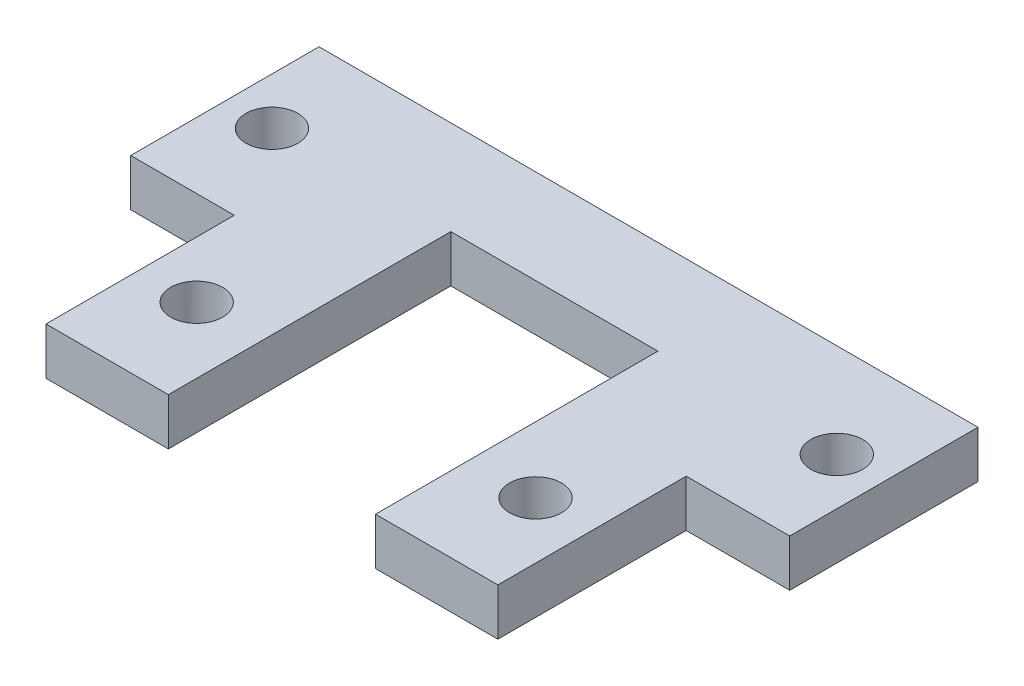
ISO-10303-21;
HEADER;
FILE_DESCRIPTION(('STEP AP214'),'2;1');
FILE_NAME('part.step','',(''),(''),'','','');
FILE_SCHEMA(('AUTOMOTIVE_DESIGN { 1 0 10303 214 1 1 1 1 }'));
ENDSEC;
DATA;
#1=APPLICATION_CONTEXT('core data for automotive mechanical design processes');
#2=APPLICATION_PROTOCOL_DEFINITION('international standard','automotive_design',2000,#1);
#3=PRODUCT_CONTEXT('',#1,'mechanical');
#4=PRODUCT('Part','Part','',(#3));
#5=PRODUCT_RELATED_PRODUCT_CATEGORY('part','',(#4));
#6=PRODUCT_DEFINITION_FORMATION('','',#4);
#7=PRODUCT_DEFINITION_CONTEXT('part definition',#1,'design');
#8=PRODUCT_DEFINITION('design','',#6,#7);
#9=PRODUCT_DEFINITION_SHAPE('','',#8);
#10=(LENGTH_UNIT() NAMED_UNIT(*) SI_UNIT(.MILLI.,.METRE.));
#11=(NAMED_UNIT(*) PLANE_ANGLE_UNIT() SI_UNIT($,.RADIAN.));
#12=(NAMED_UNIT(*) SI_UNIT($,.STERADIAN.) SOLID_ANGLE_UNIT());
#13=UNCERTAINTY_MEASURE_WITH_UNIT(LENGTH_MEASURE(1.E-05),#10,'distance_accuracy_value','');
#14=(GEOMETRIC_REPRESENTATION_CONTEXT(3) GLOBAL_UNCERTAINTY_ASSIGNED_CONTEXT((#13)) GLOBAL_UNIT_ASSIGNED_CONTEXT((#10,
#11,#12)) REPRESENTATION_CONTEXT('',''));
#15=CARTESIAN_POINT('',(0.,0.,0.));
#16=DIRECTION('',(0.,0.,1.));
#17=DIRECTION('',(1.,0.,0.));
#18=AXIS2_PLACEMENT_3D('',#15,#16,#17);
#19=CARTESIAN_POINT('',(0.,3.175,19.05));
#20=DIRECTION('',(0.,0.,1.));
#21=DIRECTION('',(1.,0.,0.));
#22=AXIS2_PLACEMENT_3D('',#19,#20,#21);
#23=PLANE('',#22);
#24=DIRECTION('',(0.,1.,0.));
#25=VECTOR('',#24,1.);
#26=CARTESIAN_POINT('',(6.985,-22.225,19.05));
#27=LINE('',#26,#25);
#28=CARTESIAN_POINT('',(6.985,0.,19.05));
#29=VERTEX_POINT('',#28);
#30=CARTESIAN_POINT('',(6.985,3.175,19.05));
#31=VERTEX_POINT('',#30);
#32=EDGE_CURVE('E311',#29,#31,#27,.T.);
#33=ORIENTED_EDGE('',*,*,#32,.F.);
#34=DIRECTION('',(-1.,0.,0.));
#35=VECTOR('',#34,1.);
#36=CARTESIAN_POINT('',(0.,0.,19.05));
#37=LINE('',#36,#35);
#38=CARTESIAN_POINT('',(15.24,0.,19.05));
#39=VERTEX_POINT('',#38);
#40=EDGE_CURVE('E184',#39,#29,#37,.T.);
#41=ORIENTED_EDGE('',*,*,#40,.F.);
#42=DIRECTION('',(0.,-1.,0.));
#43=VECTOR('',#42,1.);
#44=CARTESIAN_POINT('',(15.24,3.175,19.05));
#45=LINE('',#44,#43);
#46=CARTESIAN_POINT('',(15.24,3.175,19.05));
#47=VERTEX_POINT('',#46);
#48=EDGE_CURVE('E69',#47,#39,#45,.T.);
#49=ORIENTED_EDGE('',*,*,#48,.F.);
#50=DIRECTION('',(-1.,0.,0.));
#51=VECTOR('',#50,1.);
#52=CARTESIAN_POINT('',(0.,3.175,19.05));
#53=LINE('',#52,#51);
#54=EDGE_CURVE('E156',#47,#31,#53,.T.);
#55=ORIENTED_EDGE('',*,*,#54,.T.);
#56=EDGE_LOOP('',(#33,#41,#49,#55));
#57=FACE_BOUND('',#56,.T.);
#58=ADVANCED_FACE('F45',(#57),#23,.T.);
#59=CARTESIAN_POINT('',(15.24,3.175,0.));
#60=DIRECTION('',(1.,0.,0.));
#61=DIRECTION('',(0.,0.,-1.));
#62=AXIS2_PLACEMENT_3D('',#59,#60,#61);
#63=PLANE('',#62);
#64=DIRECTION('',(0.,0.,1.));
#65=VECTOR('',#64,1.);
#66=CARTESIAN_POINT('',(15.24,0.,0.));
#67=LINE('',#66,#65);
#68=CARTESIAN_POINT('',(15.24,0.,6.35));
#69=VERTEX_POINT('',#68);
#70=EDGE_CURVE('E167',#69,#39,#67,.T.);
#71=ORIENTED_EDGE('',*,*,#70,.F.);
#72=DIRECTION('',(0.,-1.,0.));
#73=VECTOR('',#72,1.);
#74=CARTESIAN_POINT('',(15.24,3.175,6.35));
#75=LINE('',#74,#73);
#76=CARTESIAN_POINT('',(15.24,3.175,6.35));
#77=VERTEX_POINT('',#76);
#78=EDGE_CURVE('E105',#77,#69,#75,.T.);
#79=ORIENTED_EDGE('',*,*,#78,.F.);
#80=DIRECTION('',(0.,0.,1.));
#81=VECTOR('',#80,1.);
#82=CARTESIAN_POINT('',(15.24,3.175,0.));
#83=LINE('',#82,#81);
#84=EDGE_CURVE('E193',#77,#47,#83,.T.);
#85=ORIENTED_EDGE('',*,*,#84,.T.);
#86=ORIENTED_EDGE('',*,*,#48,.T.);
#87=EDGE_LOOP('',(#71,#79,#85,#86));
#88=FACE_BOUND('',#87,.T.);
#89=ADVANCED_FACE('F47',(#88),#63,.T.);
#90=CARTESIAN_POINT('',(0.,3.175,6.35));
#91=DIRECTION('',(0.,0.,-1.));
#92=DIRECTION('',(-1.,0.,0.));
#93=AXIS2_PLACEMENT_3D('',#90,#91,#92);
#94=PLANE('',#93);
#95=DIRECTION('',(1.,0.,0.));
#96=VECTOR('',#95,1.);
#97=CARTESIAN_POINT('',(0.,0.,6.35));
#98=LINE('',#97,#96);
#99=CARTESIAN_POINT('',(22.225,0.,6.35));
#100=VERTEX_POINT('',#99);
#101=EDGE_CURVE('E169',#69,#100,#98,.T.);
#102=ORIENTED_EDGE('',*,*,#101,.T.);
#103=DIRECTION('',(0.,-1.,0.));
#104=VECTOR('',#103,1.);
#105=CARTESIAN_POINT('',(22.225,3.175,6.35));
#106=LINE('',#105,#104);
#107=CARTESIAN_POINT('',(22.225,3.175,6.35));
#108=VERTEX_POINT('',#107);
#109=EDGE_CURVE('E201',#108,#100,#106,.T.);
#110=ORIENTED_EDGE('',*,*,#109,.F.);
#111=DIRECTION('',(1.,0.,0.));
#112=VECTOR('',#111,1.);
#113=CARTESIAN_POINT('',(0.,3.175,6.35));
#114=LINE('',#113,#112);
#115=EDGE_CURVE('E140',#77,#108,#114,.T.);
#116=ORIENTED_EDGE('',*,*,#115,.F.);
#117=ORIENTED_EDGE('',*,*,#78,.T.);
#118=EDGE_LOOP('',(#102,#110,#116,#117));
#119=FACE_BOUND('',#118,.T.);
#120=ADVANCED_FACE('F242',(#119),#94,.F.);
#121=CARTESIAN_POINT('',(22.225,3.175,0.));
#122=DIRECTION('',(1.,0.,0.));
#123=DIRECTION('',(0.,0.,-1.));
#124=AXIS2_PLACEMENT_3D('',#121,#122,#123);
#125=PLANE('',#124);
#126=DIRECTION('',(0.,0.,1.));
#127=VECTOR('',#126,1.);
#128=CARTESIAN_POINT('',(22.225,0.,0.));
#129=LINE('',#128,#127);
#130=CARTESIAN_POINT('',(22.225,0.,-6.35));
#131=VERTEX_POINT('',#130);
#132=EDGE_CURVE('E173',#131,#100,#129,.T.);
#133=ORIENTED_EDGE('',*,*,#132,.F.);
#134=DIRECTION('',(0.,-1.,0.));
#135=VECTOR('',#134,1.);
#136=CARTESIAN_POINT('',(22.225,3.175,-6.35));
#137=LINE('',#136,#135);
#138=CARTESIAN_POINT('',(22.225,3.175,-6.35));
#139=VERTEX_POINT('',#138);
#140=EDGE_CURVE('E199',#139,#131,#137,.T.);
#141=ORIENTED_EDGE('',*,*,#140,.F.);
#142=DIRECTION('',(0.,0.,1.));
#143=VECTOR('',#142,1.);
#144=CARTESIAN_POINT('',(22.225,3.175,0.));
#145=LINE('',#144,#143);
#146=EDGE_CURVE('E321',#139,#108,#145,.T.);
#147=ORIENTED_EDGE('',*,*,#146,.T.);
#148=ORIENTED_EDGE('',*,*,#109,.T.);
#149=EDGE_LOOP('',(#133,#141,#147,#148));
#150=FACE_BOUND('',#149,.T.);
#151=ADVANCED_FACE('F237',(#150),#125,.T.);
#152=CARTESIAN_POINT('',(0.,3.175,-6.35));
#153=DIRECTION('',(0.,0.,-1.));
#154=DIRECTION('',(-1.,0.,0.));
#155=AXIS2_PLACEMENT_3D('',#152,#153,#154);
#156=PLANE('',#155);
#157=DIRECTION('',(1.,0.,0.));
#158=VECTOR('',#157,1.);
#159=CARTESIAN_POINT('',(0.,0.,-6.35));
#160=LINE('',#159,#158);
#161=CARTESIAN_POINT('',(-22.225,0.,-6.35));
#162=VERTEX_POINT('',#161);
#163=EDGE_CURVE('E176',#162,#131,#160,.T.);
#164=ORIENTED_EDGE('',*,*,#163,.F.);
#165=DIRECTION('',(0.,-1.,0.));
#166=VECTOR('',#165,1.);
#167=CARTESIAN_POINT('',(-22.225,3.175,-6.35));
#168=LINE('',#167,#166);
#169=CARTESIAN_POINT('',(-22.225,3.175,-6.35));
#170=VERTEX_POINT('',#169);
#171=EDGE_CURVE('E197',#170,#162,#168,.T.);
#172=ORIENTED_EDGE('',*,*,#171,.F.);
#173=DIRECTION('',(1.,0.,0.));
#174=VECTOR('',#173,1.);
#175=CARTESIAN_POINT('',(0.,3.175,-6.35));
#176=LINE('',#175,#174);
#177=EDGE_CURVE('E233',#170,#139,#176,.T.);
#178=ORIENTED_EDGE('',*,*,#177,.T.);
#179=ORIENTED_EDGE('',*,*,#140,.T.);
#180=EDGE_LOOP('',(#164,#172,#178,#179));
#181=FACE_BOUND('',#180,.T.);
#182=ADVANCED_FACE('F230',(#181),#156,.T.);
#183=CARTESIAN_POINT('',(-22.225,3.175,0.));
#184=DIRECTION('',(1.,0.,0.));
#185=DIRECTION('',(0.,0.,-1.));
#186=AXIS2_PLACEMENT_3D('',#183,#184,#185);
#187=PLANE('',#186);
#188=DIRECTION('',(0.,0.,1.));
#189=VECTOR('',#188,1.);
#190=CARTESIAN_POINT('',(-22.225,0.,0.));
#191=LINE('',#190,#189);
#192=CARTESIAN_POINT('',(-22.225,0.,6.35));
#193=VERTEX_POINT('',#192);
#194=EDGE_CURVE('E179',#162,#193,#191,.T.);
#195=ORIENTED_EDGE('',*,*,#194,.T.);
#196=DIRECTION('',(0.,-1.,0.));
#197=VECTOR('',#196,1.);
#198=CARTESIAN_POINT('',(-22.225,3.175,6.35));
#199=LINE('',#198,#197);
#200=CARTESIAN_POINT('',(-22.225,3.175,6.35));
#201=VERTEX_POINT('',#200);
#202=EDGE_CURVE('E149',#201,#193,#199,.T.);
#203=ORIENTED_EDGE('',*,*,#202,.F.);
#204=DIRECTION('',(0.,0.,1.));
#205=VECTOR('',#204,1.);
#206=CARTESIAN_POINT('',(-22.225,3.175,0.));
#207=LINE('',#206,#205);
#208=EDGE_CURVE('E135',#170,#201,#207,.T.);
#209=ORIENTED_EDGE('',*,*,#208,.F.);
#210=ORIENTED_EDGE('',*,*,#171,.T.);
#211=EDGE_LOOP('',(#195,#203,#209,#210));
#212=FACE_BOUND('',#211,.T.);
#213=ADVANCED_FACE('F415',(#212),#187,.F.);
#214=CARTESIAN_POINT('',(-15.24,0.,6.35));
#215=VERTEX_POINT('',#214);
#216=EDGE_CURVE('E145',#193,#215,#98,.T.);
#217=ORIENTED_EDGE('',*,*,#216,.T.);
#218=DIRECTION('',(0.,-1.,0.));
#219=VECTOR('',#218,1.);
#220=CARTESIAN_POINT('',(-15.24,3.175,6.35));
#221=LINE('',#220,#219);
#222=CARTESIAN_POINT('',(-15.24,3.175,6.35));
#223=VERTEX_POINT('',#222);
#224=EDGE_CURVE('E142',#223,#215,#221,.T.);
#225=ORIENTED_EDGE('',*,*,#224,.F.);
#226=EDGE_CURVE('E124',#201,#223,#114,.T.);
#227=ORIENTED_EDGE('',*,*,#226,.F.);
#228=ORIENTED_EDGE('',*,*,#202,.T.);
#229=EDGE_LOOP('',(#217,#225,#227,#228));
#230=FACE_BOUND('',#229,.T.);
#231=ADVANCED_FACE('F143',(#230),#94,.F.);
#232=CARTESIAN_POINT('',(-15.24,3.175,0.));
#233=DIRECTION('',(1.,0.,0.));
#234=DIRECTION('',(0.,0.,-1.));
#235=AXIS2_PLACEMENT_3D('',#232,#233,#234);
#236=PLANE('',#235);
#237=DIRECTION('',(0.,0.,1.));
#238=VECTOR('',#237,1.);
#239=CARTESIAN_POINT('',(-15.24,0.,0.));
#240=LINE('',#239,#238);
#241=CARTESIAN_POINT('',(-15.24,0.,19.05));
#242=VERTEX_POINT('',#241);
#243=EDGE_CURVE('E181',#215,#242,#240,.T.);
#244=ORIENTED_EDGE('',*,*,#243,.T.);
#245=DIRECTION('',(0.,-1.,0.));
#246=VECTOR('',#245,1.);
#247=CARTESIAN_POINT('',(-15.24,3.175,19.05));
#248=LINE('',#247,#246);
#249=CARTESIAN_POINT('',(-15.24,3.175,19.05));
#250=VERTEX_POINT('',#249);
#251=EDGE_CURVE('E150',#250,#242,#248,.T.);
#252=ORIENTED_EDGE('',*,*,#251,.F.);
#253=DIRECTION('',(0.,0.,1.));
#254=VECTOR('',#253,1.);
#255=CARTESIAN_POINT('',(-15.24,3.175,0.));
#256=LINE('',#255,#254);
#257=EDGE_CURVE('E131',#223,#250,#256,.T.);
#258=ORIENTED_EDGE('',*,*,#257,.F.);
#259=ORIENTED_EDGE('',*,*,#224,.T.);
#260=EDGE_LOOP('',(#244,#252,#258,#259));
#261=FACE_BOUND('',#260,.T.);
#262=ADVANCED_FACE('F152',(#261),#236,.F.);
#263=CARTESIAN_POINT('',(19.05,3.175,0.));
#264=DIRECTION('',(0.,-1.,0.));
#265=DIRECTION('',(0.,0.,-1.));
#266=AXIS2_PLACEMENT_3D('',#263,#264,#265);
#267=CYLINDRICAL_SURFACE('',#266,1.75);
#268=CARTESIAN_POINT('',(19.05,3.175,0.));
#269=DIRECTION('',(0.,1.,0.));
#270=DIRECTION('',(0.,0.,1.));
#271=AXIS2_PLACEMENT_3D('',#268,#269,#270);
#272=CIRCLE('',#271,1.75);
#273=CARTESIAN_POINT('',(19.05,3.175,1.75));
#274=VERTEX_POINT('',#273);
#275=EDGE_CURVE('E161',#274,#274,#272,.T.);
#276=ORIENTED_EDGE('',*,*,#275,.T.);
#277=EDGE_LOOP('',(#276));
#278=FACE_BOUND('',#277,.T.);
#279=CARTESIAN_POINT('',(19.05,0.,0.));
#280=DIRECTION('',(0.,1.,0.));
#281=DIRECTION('',(0.,0.,1.));
#282=AXIS2_PLACEMENT_3D('',#279,#280,#281);
#283=CIRCLE('',#282,1.75);
#284=CARTESIAN_POINT('',(19.05,0.,1.75));
#285=VERTEX_POINT('',#284);
#286=EDGE_CURVE('E187',#285,#285,#283,.T.);
#287=ORIENTED_EDGE('',*,*,#286,.F.);
#288=EDGE_LOOP('',(#287));
#289=FACE_BOUND('',#288,.T.);
#290=ADVANCED_FACE('F257',(#278,#289),#267,.F.);
#291=DIRECTION('',(0.,1.,0.));
#292=VECTOR('',#291,1.);
#293=CARTESIAN_POINT('',(-6.985,-22.225,19.05));
#294=LINE('',#293,#292);
#295=CARTESIAN_POINT('',(-6.985,0.,19.05));
#296=VERTEX_POINT('',#295);
#297=CARTESIAN_POINT('',(-6.985,3.175,19.05));
#298=VERTEX_POINT('',#297);
#299=EDGE_CURVE('E225',#296,#298,#294,.T.);
#300=ORIENTED_EDGE('',*,*,#299,.T.);
#301=EDGE_CURVE('E154',#298,#250,#53,.T.);
#302=ORIENTED_EDGE('',*,*,#301,.T.);
#303=ORIENTED_EDGE('',*,*,#251,.T.);
#304=EDGE_CURVE('E183',#296,#242,#37,.T.);
#305=ORIENTED_EDGE('',*,*,#304,.F.);
#306=EDGE_LOOP('',(#300,#302,#303,#305));
#307=FACE_BOUND('',#306,.T.);
#308=ADVANCED_FACE('F223',(#307),#23,.T.);
#309=CARTESIAN_POINT('',(-19.05,3.175,0.));
#310=DIRECTION('',(0.,-1.,0.));
#311=DIRECTION('',(0.,0.,-1.));
#312=AXIS2_PLACEMENT_3D('',#309,#310,#311);
#313=CYLINDRICAL_SURFACE('',#312,1.75);
#314=CARTESIAN_POINT('',(-19.05,3.175,0.));
#315=DIRECTION('',(0.,1.,0.));
#316=DIRECTION('',(0.,0.,1.));
#317=AXIS2_PLACEMENT_3D('',#314,#315,#316);
#318=CIRCLE('',#317,1.75);
#319=CARTESIAN_POINT('',(-19.05,3.175,1.75));
#320=VERTEX_POINT('',#319);
#321=EDGE_CURVE('E164',#320,#320,#318,.T.);
#322=ORIENTED_EDGE('',*,*,#321,.T.);
#323=EDGE_LOOP('',(#322));
#324=FACE_BOUND('',#323,.T.);
#325=CARTESIAN_POINT('',(-19.05,0.,0.));
#326=DIRECTION('',(0.,1.,0.));
#327=DIRECTION('',(0.,0.,1.));
#328=AXIS2_PLACEMENT_3D('',#325,#326,#327);
#329=CIRCLE('',#328,1.75);
#330=CARTESIAN_POINT('',(-19.05,0.,1.75));
#331=VERTEX_POINT('',#330);
#332=EDGE_CURVE('E190',#331,#331,#329,.T.);
#333=ORIENTED_EDGE('',*,*,#332,.F.);
#334=EDGE_LOOP('',(#333));
#335=FACE_BOUND('',#334,.T.);
#336=ADVANCED_FACE('F256',(#324,#335),#313,.F.);
#337=CARTESIAN_POINT('',(0.,3.175,0.));
#338=DIRECTION('',(0.,1.,0.));
#339=DIRECTION('',(0.,0.,1.));
#340=AXIS2_PLACEMENT_3D('',#337,#338,#339);
#341=PLANE('',#340);
#342=DIRECTION('',(0.,0.,-1.));
#343=VECTOR('',#342,1.);
#344=CARTESIAN_POINT('',(6.985,3.175,19.05));
#345=LINE('',#344,#343);
#346=CARTESIAN_POINT('',(6.985,3.175,0.));
#347=VERTEX_POINT('',#346);
#348=EDGE_CURVE('E305',#31,#347,#345,.T.);
#349=ORIENTED_EDGE('',*,*,#348,.F.);
#350=ORIENTED_EDGE('',*,*,#54,.F.);
#351=ORIENTED_EDGE('',*,*,#84,.F.);
#352=ORIENTED_EDGE('',*,*,#115,.T.);
#353=ORIENTED_EDGE('',*,*,#146,.F.);
#354=ORIENTED_EDGE('',*,*,#177,.F.);
#355=ORIENTED_EDGE('',*,*,#208,.T.);
#356=ORIENTED_EDGE('',*,*,#226,.T.);
#357=ORIENTED_EDGE('',*,*,#257,.T.);
#358=ORIENTED_EDGE('',*,*,#301,.F.);
#359=DIRECTION('',(0.,0.,1.));
#360=VECTOR('',#359,1.);
#361=CARTESIAN_POINT('',(-6.985,3.175,19.05));
#362=LINE('',#361,#360);
#363=CARTESIAN_POINT('',(-6.985,3.175,0.));
#364=VERTEX_POINT('',#363);
#365=EDGE_CURVE('E295',#364,#298,#362,.T.);
#366=ORIENTED_EDGE('',*,*,#365,.F.);
#367=DIRECTION('',(-1.,0.,0.));
#368=VECTOR('',#367,1.);
#369=CARTESIAN_POINT('',(6.985,3.175,0.));
#370=LINE('',#369,#368);
#371=EDGE_CURVE('E302',#347,#364,#370,.T.);
#372=ORIENTED_EDGE('',*,*,#371,.F.);
#373=EDGE_LOOP('',(#349,#350,#351,#352,#353,#354,#355,#356,#357,#358,#366,#372));
#374=FACE_BOUND('',#373,.T.);
#375=CARTESIAN_POINT('',(11.43,3.175,12.7));
#376=DIRECTION('',(0.,1.,0.));
#377=DIRECTION('',(0.,0.,1.));
#378=AXIS2_PLACEMENT_3D('',#375,#376,#377);
#379=CIRCLE('',#378,1.75);
#380=CARTESIAN_POINT('',(11.43,3.175,14.45));
#381=VERTEX_POINT('',#380);
#382=EDGE_CURVE('E208',#381,#381,#379,.T.);
#383=ORIENTED_EDGE('',*,*,#382,.F.);
#384=EDGE_LOOP('',(#383));
#385=FACE_BOUND('',#384,.T.);
#386=CARTESIAN_POINT('',(-11.43,3.175,12.7));
#387=DIRECTION('',(0.,1.,0.));
#388=DIRECTION('',(0.,0.,-1.));
#389=AXIS2_PLACEMENT_3D('',#386,#387,#388);
#390=CIRCLE('',#389,1.75);
#391=CARTESIAN_POINT('',(-11.43,3.175,10.95));
#392=VERTEX_POINT('',#391);
#393=EDGE_CURVE('E314',#392,#392,#390,.T.);
#394=ORIENTED_EDGE('',*,*,#393,.F.);
#395=EDGE_LOOP('',(#394));
#396=FACE_BOUND('',#395,.T.);
#397=ORIENTED_EDGE('',*,*,#275,.F.);
#398=EDGE_LOOP('',(#397));
#399=FACE_BOUND('',#398,.T.);
#400=ORIENTED_EDGE('',*,*,#321,.F.);
#401=EDGE_LOOP('',(#400));
#402=FACE_BOUND('',#401,.T.);
#403=ADVANCED_FACE('F127',(#374,#385,#396,#399,#402),#341,.T.);
#404=CARTESIAN_POINT('',(0.,0.,0.));
#405=DIRECTION('',(0.,1.,0.));
#406=DIRECTION('',(0.,0.,1.));
#407=AXIS2_PLACEMENT_3D('',#404,#405,#406);
#408=PLANE('',#407);
#409=ORIENTED_EDGE('',*,*,#40,.T.);
#410=DIRECTION('',(0.,0.,-1.));
#411=VECTOR('',#410,1.);
#412=CARTESIAN_POINT('',(6.985,0.,0.));
#413=LINE('',#412,#411);
#414=CARTESIAN_POINT('',(6.985,0.,0.));
#415=VERTEX_POINT('',#414);
#416=EDGE_CURVE('E11',#29,#415,#413,.T.);
#417=ORIENTED_EDGE('',*,*,#416,.T.);
#418=DIRECTION('',(-1.,0.,0.));
#419=VECTOR('',#418,1.);
#420=CARTESIAN_POINT('',(0.,0.,0.));
#421=LINE('',#420,#419);
#422=CARTESIAN_POINT('',(-6.985,0.,0.));
#423=VERTEX_POINT('',#422);
#424=EDGE_CURVE('E204',#415,#423,#421,.T.);
#425=ORIENTED_EDGE('',*,*,#424,.T.);
#426=DIRECTION('',(0.,0.,1.));
#427=VECTOR('',#426,1.);
#428=CARTESIAN_POINT('',(-6.985,0.,0.));
#429=LINE('',#428,#427);
#430=EDGE_CURVE('E53',#423,#296,#429,.T.);
#431=ORIENTED_EDGE('',*,*,#430,.T.);
#432=ORIENTED_EDGE('',*,*,#304,.T.);
#433=ORIENTED_EDGE('',*,*,#243,.F.);
#434=ORIENTED_EDGE('',*,*,#216,.F.);
#435=ORIENTED_EDGE('',*,*,#194,.F.);
#436=ORIENTED_EDGE('',*,*,#163,.T.);
#437=ORIENTED_EDGE('',*,*,#132,.T.);
#438=ORIENTED_EDGE('',*,*,#101,.F.);
#439=ORIENTED_EDGE('',*,*,#70,.T.);
#440=EDGE_LOOP('',(#409,#417,#425,#431,#432,#433,#434,#435,#436,#437,#438,#439));
#441=FACE_BOUND('',#440,.T.);
#442=CARTESIAN_POINT('',(11.43,0.,12.7));
#443=DIRECTION('',(0.,1.,0.));
#444=DIRECTION('',(0.,0.,1.));
#445=AXIS2_PLACEMENT_3D('',#442,#443,#444);
#446=CIRCLE('',#445,1.75);
#447=CARTESIAN_POINT('',(11.43,0.,14.45));
#448=VERTEX_POINT('',#447);
#449=EDGE_CURVE('E170',#448,#448,#446,.T.);
#450=ORIENTED_EDGE('',*,*,#449,.T.);
#451=EDGE_LOOP('',(#450));
#452=FACE_BOUND('',#451,.T.);
#453=CARTESIAN_POINT('',(-11.43,0.,12.7));
#454=DIRECTION('',(0.,1.,0.));
#455=DIRECTION('',(0.,0.,1.));
#456=AXIS2_PLACEMENT_3D('',#453,#454,#455);
#457=CIRCLE('',#456,1.75);
#458=CARTESIAN_POINT('',(-11.43,0.,14.45));
#459=VERTEX_POINT('',#458);
#460=EDGE_CURVE('E205',#459,#459,#457,.T.);
#461=ORIENTED_EDGE('',*,*,#460,.T.);
#462=EDGE_LOOP('',(#461));
#463=FACE_BOUND('',#462,.T.);
#464=ORIENTED_EDGE('',*,*,#286,.T.);
#465=EDGE_LOOP('',(#464));
#466=FACE_BOUND('',#465,.T.);
#467=ORIENTED_EDGE('',*,*,#332,.T.);
#468=EDGE_LOOP('',(#467));
#469=FACE_BOUND('',#468,.T.);
#470=ADVANCED_FACE('F216',(#441,#452,#463,#466,#469),#408,.F.);
#471=CARTESIAN_POINT('',(-11.43,-9.017,12.7));
#472=DIRECTION('',(0.,1.,0.));
#473=DIRECTION('',(0.,0.,1.));
#474=AXIS2_PLACEMENT_3D('',#471,#472,#473);
#475=CYLINDRICAL_SURFACE('',#474,1.75);
#476=ORIENTED_EDGE('',*,*,#393,.T.);
#477=EDGE_LOOP('',(#476));
#478=FACE_BOUND('',#477,.T.);
#479=ORIENTED_EDGE('',*,*,#460,.F.);
#480=EDGE_LOOP('',(#479));
#481=FACE_BOUND('',#480,.T.);
#482=ADVANCED_FACE('F273',(#478,#481),#475,.F.);
#483=CARTESIAN_POINT('',(11.43,-9.017,12.7));
#484=DIRECTION('',(0.,1.,0.));
#485=DIRECTION('',(0.,0.,1.));
#486=AXIS2_PLACEMENT_3D('',#483,#484,#485);
#487=CYLINDRICAL_SURFACE('',#486,1.75);
#488=ORIENTED_EDGE('',*,*,#382,.T.);
#489=EDGE_LOOP('',(#488));
#490=FACE_BOUND('',#489,.T.);
#491=ORIENTED_EDGE('',*,*,#449,.F.);
#492=EDGE_LOOP('',(#491));
#493=FACE_BOUND('',#492,.T.);
#494=ADVANCED_FACE('F277',(#490,#493),#487,.F.);
#495=CARTESIAN_POINT('',(6.985,-22.225,19.05));
#496=DIRECTION('',(1.,0.,0.));
#497=DIRECTION('',(0.,0.,-1.));
#498=AXIS2_PLACEMENT_3D('',#495,#496,#497);
#499=PLANE('',#498);
#500=ORIENTED_EDGE('',*,*,#32,.T.);
#501=ORIENTED_EDGE('',*,*,#348,.T.);
#502=DIRECTION('',(0.,1.,0.));
#503=VECTOR('',#502,1.);
#504=CARTESIAN_POINT('',(6.985,-22.225,0.));
#505=LINE('',#504,#503);
#506=EDGE_CURVE('E298',#415,#347,#505,.T.);
#507=ORIENTED_EDGE('',*,*,#506,.F.);
#508=ORIENTED_EDGE('',*,*,#416,.F.);
#509=EDGE_LOOP('',(#500,#501,#507,#508));
#510=FACE_BOUND('',#509,.T.);
#511=ADVANCED_FACE('F280',(#510),#499,.F.);
#512=CARTESIAN_POINT('',(-6.985,-22.225,19.05));
#513=DIRECTION('',(-1.,0.,0.));
#514=DIRECTION('',(0.,0.,1.));
#515=AXIS2_PLACEMENT_3D('',#512,#513,#514);
#516=PLANE('',#515);
#517=DIRECTION('',(0.,1.,0.));
#518=VECTOR('',#517,1.);
#519=CARTESIAN_POINT('',(-6.985,-22.225,0.));
#520=LINE('',#519,#518);
#521=EDGE_CURVE('E60',#423,#364,#520,.T.);
#522=ORIENTED_EDGE('',*,*,#521,.T.);
#523=ORIENTED_EDGE('',*,*,#365,.T.);
#524=ORIENTED_EDGE('',*,*,#299,.F.);
#525=ORIENTED_EDGE('',*,*,#430,.F.);
#526=EDGE_LOOP('',(#522,#523,#524,#525));
#527=FACE_BOUND('',#526,.T.);
#528=ADVANCED_FACE('F284',(#527),#516,.F.);
#529=CARTESIAN_POINT('',(6.985,-22.225,0.));
#530=DIRECTION('',(0.,0.,-1.));
#531=DIRECTION('',(-1.,0.,0.));
#532=AXIS2_PLACEMENT_3D('',#529,#530,#531);
#533=PLANE('',#532);
#534=ORIENTED_EDGE('',*,*,#506,.T.);
#535=ORIENTED_EDGE('',*,*,#371,.T.);
#536=ORIENTED_EDGE('',*,*,#521,.F.);
#537=ORIENTED_EDGE('',*,*,#424,.F.);
#538=EDGE_LOOP('',(#534,#535,#536,#537));
#539=FACE_BOUND('',#538,.T.);
#540=ADVANCED_FACE('F286',(#539),#533,.F.);
#541=CLOSED_SHELL('',(#58,#89,#120,#151,#182,#213,#231,#262,#290,#308,#336,#403,#470,#482,#494,
#511,#528,#540));
#542=MANIFOLD_SOLID_BREP('B2',#541);
#543=ADVANCED_BREP_SHAPE_REPRESENTATION('',(#18,#542),#14);
#544=SHAPE_DEFINITION_REPRESENTATION(#9,#543);
ENDSEC;
END-ISO-10303-21;
